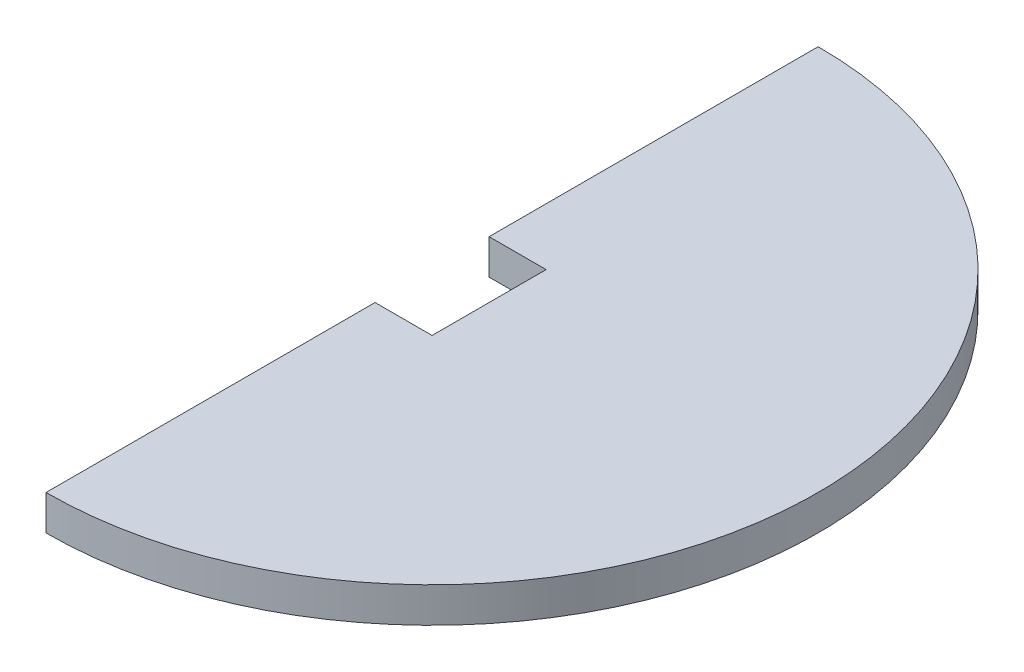
ISO-10303-21;
HEADER;
FILE_DESCRIPTION(('STEP AP214'),'2;1');
FILE_NAME('part.step','',(''),(''),'','','');
FILE_SCHEMA(('AUTOMOTIVE_DESIGN { 1 0 10303 214 1 1 1 1 }'));
ENDSEC;
DATA;
#1=APPLICATION_CONTEXT('core data for automotive mechanical design processes');
#2=APPLICATION_PROTOCOL_DEFINITION('international standard','automotive_design',2000,#1);
#3=PRODUCT_CONTEXT('',#1,'mechanical');
#4=PRODUCT('Part','Part','',(#3));
#5=PRODUCT_RELATED_PRODUCT_CATEGORY('part','',(#4));
#6=PRODUCT_DEFINITION_FORMATION('','',#4);
#7=PRODUCT_DEFINITION_CONTEXT('part definition',#1,'design');
#8=PRODUCT_DEFINITION('design','',#6,#7);
#9=PRODUCT_DEFINITION_SHAPE('','',#8);
#10=(LENGTH_UNIT() NAMED_UNIT(*) SI_UNIT(.MILLI.,.METRE.));
#11=(NAMED_UNIT(*) PLANE_ANGLE_UNIT() SI_UNIT($,.RADIAN.));
#12=(NAMED_UNIT(*) SI_UNIT($,.STERADIAN.) SOLID_ANGLE_UNIT());
#13=UNCERTAINTY_MEASURE_WITH_UNIT(LENGTH_MEASURE(1.E-05),#10,'distance_accuracy_value','');
#14=(GEOMETRIC_REPRESENTATION_CONTEXT(3) GLOBAL_UNCERTAINTY_ASSIGNED_CONTEXT((#13)) GLOBAL_UNIT_ASSIGNED_CONTEXT((#10,
#11,#12)) REPRESENTATION_CONTEXT('',''));
#15=CARTESIAN_POINT('',(0.,0.,0.));
#16=DIRECTION('',(0.,0.,1.));
#17=DIRECTION('',(1.,0.,0.));
#18=AXIS2_PLACEMENT_3D('',#15,#16,#17);
#19=CARTESIAN_POINT('',(0.,0.,0.));
#20=DIRECTION('',(1.,0.,0.));
#21=DIRECTION('',(0.,0.,-1.));
#22=AXIS2_PLACEMENT_3D('',#19,#20,#21);
#23=PLANE('',#22);
#24=DIRECTION('',(0.,0.,-1.));
#25=VECTOR('',#24,1.);
#26=CARTESIAN_POINT('',(0.,0.,0.));
#27=LINE('',#26,#25);
#28=CARTESIAN_POINT('',(0.,0.,-20.6375));
#29=VERTEX_POINT('',#28);
#30=CARTESIAN_POINT('',(0.,0.,-139.7));
#31=VERTEX_POINT('',#30);
#32=EDGE_CURVE('E146',#29,#31,#27,.T.);
#33=ORIENTED_EDGE('',*,*,#32,.F.);
#34=DIRECTION('',(0.,-1.,0.));
#35=VECTOR('',#34,1.);
#36=CARTESIAN_POINT('',(0.,12.7,-20.6375));
#37=LINE('',#36,#35);
#38=CARTESIAN_POINT('',(0.,12.7,-20.6375));
#39=VERTEX_POINT('',#38);
#40=EDGE_CURVE('E140',#39,#29,#37,.T.);
#41=ORIENTED_EDGE('',*,*,#40,.F.);
#42=DIRECTION('',(0.,0.,-1.));
#43=VECTOR('',#42,1.);
#44=CARTESIAN_POINT('',(0.,12.7,0.));
#45=LINE('',#44,#43);
#46=CARTESIAN_POINT('',(0.,12.7,-139.7));
#47=VERTEX_POINT('',#46);
#48=EDGE_CURVE('E54',#39,#47,#45,.T.);
#49=ORIENTED_EDGE('',*,*,#48,.T.);
#50=DIRECTION('',(0.,-1.,0.));
#51=VECTOR('',#50,1.);
#52=CARTESIAN_POINT('',(0.,12.7,-139.7));
#53=LINE('',#52,#51);
#54=EDGE_CURVE('E48',#31,#47,#53,.F.);
#55=ORIENTED_EDGE('',*,*,#54,.F.);
#56=EDGE_LOOP('',(#33,#41,#49,#55));
#57=FACE_BOUND('',#56,.T.);
#58=ADVANCED_FACE('F45',(#57),#23,.F.);
#59=CARTESIAN_POINT('',(0.,12.7,139.7));
#60=VERTEX_POINT('',#59);
#61=CARTESIAN_POINT('',(0.,12.7,20.6375));
#62=VERTEX_POINT('',#61);
#63=EDGE_CURVE('E149',#60,#62,#45,.T.);
#64=ORIENTED_EDGE('',*,*,#63,.T.);
#65=DIRECTION('',(0.,-1.,0.));
#66=VECTOR('',#65,1.);
#67=CARTESIAN_POINT('',(0.,12.7,20.6375));
#68=LINE('',#67,#66);
#69=CARTESIAN_POINT('',(0.,0.,20.6375));
#70=VERTEX_POINT('',#69);
#71=EDGE_CURVE('E11',#62,#70,#68,.T.);
#72=ORIENTED_EDGE('',*,*,#71,.T.);
#73=CARTESIAN_POINT('',(0.,0.,139.7));
#74=VERTEX_POINT('',#73);
#75=EDGE_CURVE('E62',#74,#70,#27,.T.);
#76=ORIENTED_EDGE('',*,*,#75,.F.);
#77=DIRECTION('',(0.,-1.,0.));
#78=VECTOR('',#77,1.);
#79=CARTESIAN_POINT('',(0.,12.7,139.7));
#80=LINE('',#79,#78);
#81=EDGE_CURVE('E150',#60,#74,#80,.T.);
#82=ORIENTED_EDGE('',*,*,#81,.F.);
#83=EDGE_LOOP('',(#64,#72,#76,#82));
#84=FACE_BOUND('',#83,.T.);
#85=ADVANCED_FACE('F162',(#84),#23,.F.);
#86=CARTESIAN_POINT('',(0.,12.7,0.));
#87=DIRECTION('',(0.,-1.,0.));
#88=DIRECTION('',(0.,0.,-1.));
#89=AXIS2_PLACEMENT_3D('',#86,#87,#88);
#90=CYLINDRICAL_SURFACE('',#89,139.7);
#91=CARTESIAN_POINT('',(0.,12.7,0.));
#92=DIRECTION('',(0.,1.,0.));
#93=DIRECTION('',(0.,0.,1.));
#94=AXIS2_PLACEMENT_3D('',#91,#92,#93);
#95=CIRCLE('',#94,139.7);
#96=EDGE_CURVE('E137',#60,#47,#95,.T.);
#97=ORIENTED_EDGE('',*,*,#96,.F.);
#98=ORIENTED_EDGE('',*,*,#81,.T.);
#99=CARTESIAN_POINT('',(0.,0.,0.));
#100=DIRECTION('',(0.,1.,0.));
#101=DIRECTION('',(0.,0.,1.));
#102=AXIS2_PLACEMENT_3D('',#99,#100,#101);
#103=CIRCLE('',#102,139.7);
#104=EDGE_CURVE('E132',#74,#31,#103,.T.);
#105=ORIENTED_EDGE('',*,*,#104,.T.);
#106=ORIENTED_EDGE('',*,*,#54,.T.);
#107=EDGE_LOOP('',(#97,#98,#105,#106));
#108=FACE_BOUND('',#107,.T.);
#109=ADVANCED_FACE('F160',(#108),#90,.T.);
#110=CARTESIAN_POINT('',(0.,12.7,0.));
#111=DIRECTION('',(0.,1.,0.));
#112=DIRECTION('',(0.,0.,1.));
#113=AXIS2_PLACEMENT_3D('',#110,#111,#112);
#114=PLANE('',#113);
#115=ORIENTED_EDGE('',*,*,#63,.F.);
#116=ORIENTED_EDGE('',*,*,#96,.T.);
#117=ORIENTED_EDGE('',*,*,#48,.F.);
#118=DIRECTION('',(1.,0.,0.));
#119=VECTOR('',#118,1.);
#120=CARTESIAN_POINT('',(-20.6375,12.7,-20.6375));
#121=LINE('',#120,#119);
#122=CARTESIAN_POINT('',(20.6375,12.7,-20.6375));
#123=VERTEX_POINT('',#122);
#124=EDGE_CURVE('E99',#39,#123,#121,.T.);
#125=ORIENTED_EDGE('',*,*,#124,.T.);
#126=DIRECTION('',(0.,0.,-1.));
#127=VECTOR('',#126,1.);
#128=CARTESIAN_POINT('',(20.6375,12.7,20.6375));
#129=LINE('',#128,#127);
#130=CARTESIAN_POINT('',(20.6375,12.7,20.6375));
#131=VERTEX_POINT('',#130);
#132=EDGE_CURVE('E104',#131,#123,#129,.T.);
#133=ORIENTED_EDGE('',*,*,#132,.F.);
#134=DIRECTION('',(1.,0.,0.));
#135=VECTOR('',#134,1.);
#136=CARTESIAN_POINT('',(-20.6375,12.7,20.6375));
#137=LINE('',#136,#135);
#138=EDGE_CURVE('E123',#62,#131,#137,.T.);
#139=ORIENTED_EDGE('',*,*,#138,.F.);
#140=EDGE_LOOP('',(#115,#116,#117,#125,#133,#139));
#141=FACE_BOUND('',#140,.T.);
#142=ADVANCED_FACE('F102',(#141),#114,.T.);
#143=CARTESIAN_POINT('',(0.,0.,0.));
#144=DIRECTION('',(0.,1.,0.));
#145=DIRECTION('',(0.,0.,1.));
#146=AXIS2_PLACEMENT_3D('',#143,#144,#145);
#147=PLANE('',#146);
#148=ORIENTED_EDGE('',*,*,#104,.F.);
#149=ORIENTED_EDGE('',*,*,#75,.T.);
#150=DIRECTION('',(1.,0.,0.));
#151=VECTOR('',#150,1.);
#152=CARTESIAN_POINT('',(-20.6375,0.,20.6375));
#153=LINE('',#152,#151);
#154=CARTESIAN_POINT('',(20.6375,0.,20.6375));
#155=VERTEX_POINT('',#154);
#156=EDGE_CURVE('E111',#70,#155,#153,.T.);
#157=ORIENTED_EDGE('',*,*,#156,.T.);
#158=DIRECTION('',(0.,0.,-1.));
#159=VECTOR('',#158,1.);
#160=CARTESIAN_POINT('',(20.6375,0.,20.6375));
#161=LINE('',#160,#159);
#162=CARTESIAN_POINT('',(20.6375,0.,-20.6375));
#163=VERTEX_POINT('',#162);
#164=EDGE_CURVE('E165',#155,#163,#161,.T.);
#165=ORIENTED_EDGE('',*,*,#164,.T.);
#166=DIRECTION('',(1.,0.,0.));
#167=VECTOR('',#166,1.);
#168=CARTESIAN_POINT('',(-20.6375,0.,-20.6375));
#169=LINE('',#168,#167);
#170=EDGE_CURVE('E127',#29,#163,#169,.T.);
#171=ORIENTED_EDGE('',*,*,#170,.F.);
#172=ORIENTED_EDGE('',*,*,#32,.T.);
#173=EDGE_LOOP('',(#148,#149,#157,#165,#171,#172));
#174=FACE_BOUND('',#173,.T.);
#175=ADVANCED_FACE('F156',(#174),#147,.F.);
#176=CARTESIAN_POINT('',(-20.6375,12.7,-20.6375));
#177=DIRECTION('',(0.,0.,-1.));
#178=DIRECTION('',(-1.,0.,0.));
#179=AXIS2_PLACEMENT_3D('',#176,#177,#178);
#180=PLANE('',#179);
#181=ORIENTED_EDGE('',*,*,#124,.F.);
#182=ORIENTED_EDGE('',*,*,#40,.T.);
#183=ORIENTED_EDGE('',*,*,#170,.T.);
#184=DIRECTION('',(0.,-1.,0.));
#185=VECTOR('',#184,1.);
#186=CARTESIAN_POINT('',(20.6375,12.7,-20.6375));
#187=LINE('',#186,#185);
#188=EDGE_CURVE('E118',#123,#163,#187,.T.);
#189=ORIENTED_EDGE('',*,*,#188,.F.);
#190=EDGE_LOOP('',(#181,#182,#183,#189));
#191=FACE_BOUND('',#190,.T.);
#192=ADVANCED_FACE('F125',(#191),#180,.F.);
#193=CARTESIAN_POINT('',(-20.6375,12.7,20.6375));
#194=DIRECTION('',(0.,0.,-1.));
#195=DIRECTION('',(-1.,0.,0.));
#196=AXIS2_PLACEMENT_3D('',#193,#194,#195);
#197=PLANE('',#196);
#198=ORIENTED_EDGE('',*,*,#71,.F.);
#199=ORIENTED_EDGE('',*,*,#138,.T.);
#200=DIRECTION('',(0.,-1.,0.));
#201=VECTOR('',#200,1.);
#202=CARTESIAN_POINT('',(20.6375,12.7,20.6375));
#203=LINE('',#202,#201);
#204=EDGE_CURVE('E121',#131,#155,#203,.T.);
#205=ORIENTED_EDGE('',*,*,#204,.T.);
#206=ORIENTED_EDGE('',*,*,#156,.F.);
#207=EDGE_LOOP('',(#198,#199,#205,#206));
#208=FACE_BOUND('',#207,.T.);
#209=ADVANCED_FACE('F163',(#208),#197,.T.);
#210=CARTESIAN_POINT('',(20.6375,12.7,20.6375));
#211=DIRECTION('',(-1.,0.,0.));
#212=DIRECTION('',(0.,0.,1.));
#213=AXIS2_PLACEMENT_3D('',#210,#211,#212);
#214=PLANE('',#213);
#215=ORIENTED_EDGE('',*,*,#164,.F.);
#216=ORIENTED_EDGE('',*,*,#204,.F.);
#217=ORIENTED_EDGE('',*,*,#132,.T.);
#218=ORIENTED_EDGE('',*,*,#188,.T.);
#219=EDGE_LOOP('',(#215,#216,#217,#218));
#220=FACE_BOUND('',#219,.T.);
#221=ADVANCED_FACE('F117',(#220),#214,.T.);
#222=CLOSED_SHELL('',(#58,#85,#109,#142,#175,#192,#209,#221));
#223=MANIFOLD_SOLID_BREP('B2',#222);
#224=ADVANCED_BREP_SHAPE_REPRESENTATION('',(#18,#223),#14);
#225=SHAPE_DEFINITION_REPRESENTATION(#9,#224);
ENDSEC;
END-ISO-10303-21;
